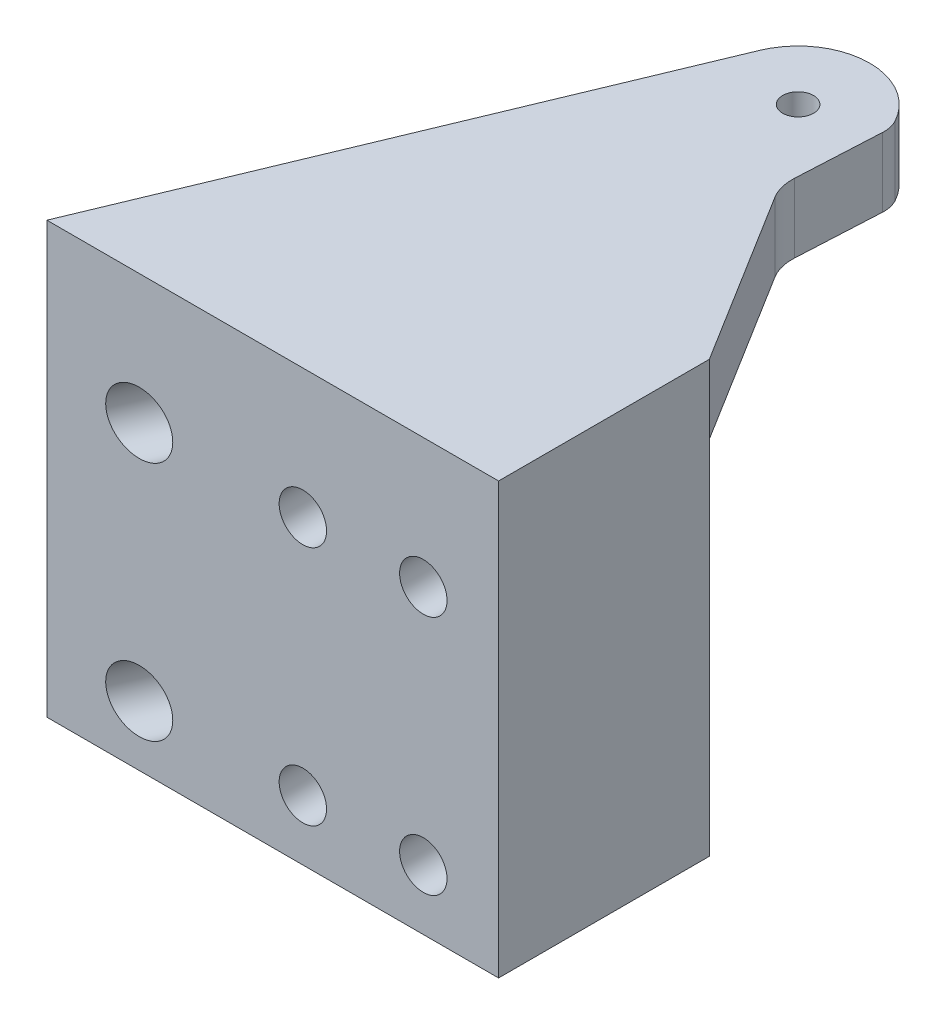
ISO-10303-21;
HEADER;
FILE_DESCRIPTION(('STEP AP214'),'2;1');
FILE_NAME('part.step','',(''),(''),'','','');
FILE_SCHEMA(('AUTOMOTIVE_DESIGN { 1 0 10303 214 1 1 1 1 }'));
ENDSEC;
DATA;
#1=APPLICATION_CONTEXT('core data for automotive mechanical design processes');
#2=APPLICATION_PROTOCOL_DEFINITION('international standard','automotive_design',2000,#1);
#3=PRODUCT_CONTEXT('',#1,'mechanical');
#4=PRODUCT('Part','Part','',(#3));
#5=PRODUCT_RELATED_PRODUCT_CATEGORY('part','',(#4));
#6=PRODUCT_DEFINITION_FORMATION('','',#4);
#7=PRODUCT_DEFINITION_CONTEXT('part definition',#1,'design');
#8=PRODUCT_DEFINITION('design','',#6,#7);
#9=PRODUCT_DEFINITION_SHAPE('','',#8);
#10=(LENGTH_UNIT() NAMED_UNIT(*) SI_UNIT(.MILLI.,.METRE.));
#11=(NAMED_UNIT(*) PLANE_ANGLE_UNIT() SI_UNIT($,.RADIAN.));
#12=(NAMED_UNIT(*) SI_UNIT($,.STERADIAN.) SOLID_ANGLE_UNIT());
#13=UNCERTAINTY_MEASURE_WITH_UNIT(LENGTH_MEASURE(1.E-05),#10,'distance_accuracy_value','');
#14=(GEOMETRIC_REPRESENTATION_CONTEXT(3) GLOBAL_UNCERTAINTY_ASSIGNED_CONTEXT((#13)) GLOBAL_UNIT_ASSIGNED_CONTEXT((#10,
#11,#12)) REPRESENTATION_CONTEXT('',''));
#15=CARTESIAN_POINT('',(0.,0.,0.));
#16=DIRECTION('',(0.,0.,1.));
#17=DIRECTION('',(1.,0.,0.));
#18=AXIS2_PLACEMENT_3D('',#15,#16,#17);
#19=CARTESIAN_POINT('',(13.39,48.,-19.59));
#20=DIRECTION('',(0.,1.,0.));
#21=DIRECTION('',(0.,0.,1.));
#22=AXIS2_PLACEMENT_3D('',#19,#20,#21);
#23=PLANE('',#22);
#24=CARTESIAN_POINT('',(13.39,48.,-19.59));
#25=DIRECTION('',(0.,1.,0.));
#26=DIRECTION('',(0.,0.,1.));
#27=AXIS2_PLACEMENT_3D('',#24,#25,#26);
#28=CIRCLE('',#27,2.05);
#29=CARTESIAN_POINT('',(13.39,48.,-17.54));
#30=VERTEX_POINT('',#29);
#31=EDGE_CURVE('E195',#30,#30,#28,.T.);
#32=ORIENTED_EDGE('',*,*,#31,.T.);
#33=EDGE_LOOP('',(#32));
#34=FACE_BOUND('',#33,.T.);
#35=DIRECTION('',(0.910085172918903,0.,0.414421256734219));
#36=VECTOR('',#35,1.);
#37=CARTESIAN_POINT('',(3.70179696506069,48.,1.68567008460874));
#38=LINE('',#37,#36);
#39=CARTESIAN_POINT('',(-4.23961622686856,48.,-1.93057434303044));
#40=VERTEX_POINT('',#39);
#41=CARTESIAN_POINT('',(0.,48.,0.));
#42=VERTEX_POINT('',#41);
#43=EDGE_CURVE('E142',#40,#42,#38,.T.);
#44=ORIENTED_EDGE('',*,*,#43,.F.);
#45=DIRECTION('',(-0.383871492776041,0.,0.923386526344138));
#46=VECTOR('',#45,1.);
#47=CARTESIAN_POINT('',(-4.29919251697204,48.,-1.78726611460927));
#48=LINE('',#47,#46);
#49=CARTESIAN_POINT('',(4.61782799973069,48.,-23.2367791813724));
#50=VERTEX_POINT('',#49);
#51=EDGE_CURVE('E273',#50,#40,#48,.T.);
#52=ORIENTED_EDGE('',*,*,#51,.F.);
#53=CARTESIAN_POINT('',(13.39,48.,-19.59));
#54=DIRECTION('',(0.,1.,0.));
#55=DIRECTION('',(0.,0.,1.));
#56=AXIS2_PLACEMENT_3D('',#53,#54,#55);
#57=CIRCLE('',#56,9.50000000000001);
#58=CARTESIAN_POINT('',(21.7590573215834,48.,-24.0854287390694));
#59=VERTEX_POINT('',#58);
#60=EDGE_CURVE('E254',#59,#50,#57,.T.);
#61=ORIENTED_EDGE('',*,*,#60,.F.);
#62=CARTESIAN_POINT('',(18.2352437124957,48.,-22.1926166384086));
#63=DIRECTION('',(0.,1.,0.));
#64=DIRECTION('',(0.,0.,1.));
#65=AXIS2_PLACEMENT_3D('',#62,#63,#64);
#66=CIRCLE('',#65,4.);
#67=CARTESIAN_POINT('',(22.2299105121146,48.,-21.9861289631768));
#68=VERTEX_POINT('',#67);
#69=EDGE_CURVE('E198',#59,#68,#66,.F.);
#70=ORIENTED_EDGE('',*,*,#69,.T.);
#71=DIRECTION('',(0.051621918807937,0.,-0.998666699904721));
#72=VECTOR('',#71,1.);
#73=CARTESIAN_POINT('',(21.0372188326345,48.,1.0874314750123));
#74=LINE('',#73,#72);
#75=CARTESIAN_POINT('',(21.6527019401257,48.,-10.8195742698201));
#76=VERTEX_POINT('',#75);
#77=EDGE_CURVE('E260',#76,#68,#74,.T.);
#78=ORIENTED_EDGE('',*,*,#77,.F.);
#79=CARTESIAN_POINT('',(27.644702139554,48.,-10.5098427569724));
#80=DIRECTION('',(0.,1.,0.));
#81=DIRECTION('',(0.,0.,1.));
#82=AXIS2_PLACEMENT_3D('',#79,#80,#81);
#83=CIRCLE('',#82,6.);
#84=CARTESIAN_POINT('',(22.5481581017996,48.,-7.34357699566459));
#85=VERTEX_POINT('',#84);
#86=EDGE_CURVE('E69',#76,#85,#83,.T.);
#87=ORIENTED_EDGE('',*,*,#86,.T.);
#88=DIRECTION('',(-0.527710960217974,0.,-0.849424006292396));
#89=VECTOR('',#88,1.);
#90=CARTESIAN_POINT('',(19.5607338113645,48.,-12.1522508731759));
#91=LINE('',#90,#89);
#92=CARTESIAN_POINT('',(36.8201941380977,48.,15.6292451395707));
#93=VERTEX_POINT('',#92);
#94=EDGE_CURVE('E166',#93,#85,#91,.T.);
#95=ORIENTED_EDGE('',*,*,#94,.F.);
#96=DIRECTION('',(-0.920504853452443,0.,-0.390731128489268));
#97=VECTOR('',#96,1.);
#98=CARTESIAN_POINT('',(36.8201941380977,48.,15.6292451395707));
#99=LINE('',#98,#97);
#100=EDGE_CURVE('E159',#93,#42,#99,.T.);
#101=ORIENTED_EDGE('',*,*,#100,.T.);
#102=EDGE_LOOP('',(#44,#52,#61,#70,#78,#87,#95,#101));
#103=FACE_BOUND('',#102,.T.);
#104=ADVANCED_FACE('F60',(#34,#103),#23,.F.);
#105=CARTESIAN_POINT('',(36.8201941380977,48.,15.6292451395707));
#106=DIRECTION('',(-0.390731128489268,0.,0.920504853452443));
#107=DIRECTION('',(0.920504853452443,0.,0.390731128489268));
#108=AXIS2_PLACEMENT_3D('',#105,#106,#107);
#109=PLANE('',#108);
#110=CARTESIAN_POINT('',(6.44353397416709,40.,2.73511789942487));
#111=DIRECTION('',(0.390731128489268,0.,-0.920504853452443));
#112=DIRECTION('',(-0.920504853452443,0.,-0.390731128489268));
#113=AXIS2_PLACEMENT_3D('',#110,#111,#112);
#114=CIRCLE('',#113,2.05);
#115=CARTESIAN_POINT('',(4.55649902458958,40.,1.93411908602187));
#116=VERTEX_POINT('',#115);
#117=EDGE_CURVE('E218',#116,#116,#114,.T.);
#118=ORIENTED_EDGE('',*,*,#117,.F.);
#119=EDGE_LOOP('',(#118));
#120=FACE_BOUND('',#119,.T.);
#121=CARTESIAN_POINT('',(6.44353397416709,8.,2.73511789942487));
#122=DIRECTION('',(0.390731128489268,0.,-0.920504853452443));
#123=DIRECTION('',(-0.920504853452443,0.,-0.390731128489268));
#124=AXIS2_PLACEMENT_3D('',#121,#122,#123);
#125=CIRCLE('',#124,2.05);
#126=CARTESIAN_POINT('',(4.55649902458958,8.,1.93411908602187));
#127=VERTEX_POINT('',#126);
#128=EDGE_CURVE('E224',#127,#127,#125,.T.);
#129=ORIENTED_EDGE('',*,*,#128,.F.);
#130=EDGE_LOOP('',(#129));
#131=FACE_BOUND('',#130,.T.);
#132=DIRECTION('',(-0.920504853452443,0.,-0.390731128489268));
#133=VECTOR('',#132,1.);
#134=CARTESIAN_POINT('',(36.8201941380977,0.,15.6292451395707));
#135=LINE('',#134,#133);
#136=CARTESIAN_POINT('',(36.8201941380977,0.,15.6292451395707));
#137=VERTEX_POINT('',#136);
#138=CARTESIAN_POINT('',(0.,0.,0.));
#139=VERTEX_POINT('',#138);
#140=EDGE_CURVE('E162',#137,#139,#135,.T.);
#141=ORIENTED_EDGE('',*,*,#140,.T.);
#142=DIRECTION('',(0.,-1.,0.));
#143=VECTOR('',#142,1.);
#144=CARTESIAN_POINT('',(0.,48.,0.));
#145=LINE('',#144,#143);
#146=EDGE_CURVE('E146',#42,#139,#145,.T.);
#147=ORIENTED_EDGE('',*,*,#146,.F.);
#148=ORIENTED_EDGE('',*,*,#100,.F.);
#149=DIRECTION('',(0.,-1.,0.));
#150=VECTOR('',#149,1.);
#151=CARTESIAN_POINT('',(36.8201941380977,48.,15.6292451395707));
#152=LINE('',#151,#150);
#153=EDGE_CURVE('E167',#93,#137,#152,.T.);
#154=ORIENTED_EDGE('',*,*,#153,.T.);
#155=EDGE_LOOP('',(#141,#147,#148,#154));
#156=FACE_BOUND('',#155,.T.);
#157=ADVANCED_FACE('F157',(#120,#131,#156),#109,.F.);
#158=CARTESIAN_POINT('',(0.,48.,43.6292451395707));
#159=DIRECTION('',(0.,0.,-1.));
#160=DIRECTION('',(-1.,0.,0.));
#161=AXIS2_PLACEMENT_3D('',#158,#159,#160);
#162=PLANE('',#161);
#163=CARTESIAN_POINT('',(-10.9149931701457,40.,43.6292451395707));
#164=DIRECTION('',(0.,0.,-1.));
#165=DIRECTION('',(1.,0.,0.));
#166=AXIS2_PLACEMENT_3D('',#163,#164,#165);
#167=ELLIPSE('',#166,4.4540775473617,4.1);
#168=CARTESIAN_POINT('',(-6.460915622784,40.,43.6292451395707));
#169=VERTEX_POINT('',#168);
#170=EDGE_CURVE('E153',#169,#169,#167,.T.);
#171=ORIENTED_EDGE('',*,*,#170,.T.);
#172=EDGE_LOOP('',(#171));
#173=FACE_BOUND('',#172,.T.);
#174=CARTESIAN_POINT('',(-10.9149931701457,8.,43.6292451395707));
#175=DIRECTION('',(0.,0.,-1.));
#176=DIRECTION('',(1.,0.,0.));
#177=AXIS2_PLACEMENT_3D('',#174,#175,#176);
#178=ELLIPSE('',#177,4.4540775473617,4.1);
#179=CARTESIAN_POINT('',(-6.460915622784,8.,43.6292451395707));
#180=VERTEX_POINT('',#179);
#181=EDGE_CURVE('E211',#180,#180,#178,.T.);
#182=ORIENTED_EDGE('',*,*,#181,.T.);
#183=EDGE_LOOP('',(#182));
#184=FACE_BOUND('',#183,.T.);
#185=DIRECTION('',(0.,-1.,0.));
#186=VECTOR('',#185,1.);
#187=CARTESIAN_POINT('',(-23.1798058619023,57.18,43.6292451395707));
#188=LINE('',#187,#186);
#189=CARTESIAN_POINT('',(-23.1798058619023,57.18,43.6292451395707));
#190=VERTEX_POINT('',#189);
#191=CARTESIAN_POINT('',(-23.1798058619023,0.,43.6292451395707));
#192=VERTEX_POINT('',#191);
#193=EDGE_CURVE('E278',#190,#192,#188,.T.);
#194=ORIENTED_EDGE('',*,*,#193,.T.);
#195=DIRECTION('',(1.,0.,0.));
#196=VECTOR('',#195,1.);
#197=CARTESIAN_POINT('',(0.,0.,43.6292451395707));
#198=LINE('',#197,#196);
#199=CARTESIAN_POINT('',(36.8201941380977,0.,43.6292451395707));
#200=VERTEX_POINT('',#199);
#201=EDGE_CURVE('E171',#192,#200,#198,.T.);
#202=ORIENTED_EDGE('',*,*,#201,.T.);
#203=DIRECTION('',(0.,-1.,0.));
#204=VECTOR('',#203,1.);
#205=CARTESIAN_POINT('',(36.8201941380977,48.,43.6292451395707));
#206=LINE('',#205,#204);
#207=CARTESIAN_POINT('',(36.8201941380977,57.18,43.6292451395707));
#208=VERTEX_POINT('',#207);
#209=EDGE_CURVE('E164',#208,#200,#206,.T.);
#210=ORIENTED_EDGE('',*,*,#209,.F.);
#211=DIRECTION('',(1.,0.,0.));
#212=VECTOR('',#211,1.);
#213=CARTESIAN_POINT('',(0.,57.18,43.6292451395707));
#214=LINE('',#213,#212);
#215=EDGE_CURVE('E262',#190,#208,#214,.T.);
#216=ORIENTED_EDGE('',*,*,#215,.F.);
#217=EDGE_LOOP('',(#194,#202,#210,#216));
#218=FACE_BOUND('',#217,.T.);
#219=CARTESIAN_POINT('',(10.8201941380977,8.,43.6292451395707));
#220=DIRECTION('',(0.,0.,1.));
#221=DIRECTION('',(1.,0.,0.));
#222=AXIS2_PLACEMENT_3D('',#219,#220,#221);
#223=CIRCLE('',#222,3.15);
#224=CARTESIAN_POINT('',(13.9701941380977,8.,43.6292451395707));
#225=VERTEX_POINT('',#224);
#226=EDGE_CURVE('E284',#225,#225,#223,.T.);
#227=ORIENTED_EDGE('',*,*,#226,.F.);
#228=EDGE_LOOP('',(#227));
#229=FACE_BOUND('',#228,.T.);
#230=CARTESIAN_POINT('',(26.8201941380977,8.,43.6292451395707));
#231=DIRECTION('',(0.,0.,1.));
#232=DIRECTION('',(1.,0.,0.));
#233=AXIS2_PLACEMENT_3D('',#230,#231,#232);
#234=CIRCLE('',#233,3.14999999999998);
#235=CARTESIAN_POINT('',(29.9701941380977,8.,43.6292451395707));
#236=VERTEX_POINT('',#235);
#237=EDGE_CURVE('E294',#236,#236,#234,.T.);
#238=ORIENTED_EDGE('',*,*,#237,.F.);
#239=EDGE_LOOP('',(#238));
#240=FACE_BOUND('',#239,.T.);
#241=CARTESIAN_POINT('',(26.8201941380977,40.,43.6292451395707));
#242=DIRECTION('',(0.,0.,1.));
#243=DIRECTION('',(1.,0.,0.));
#244=AXIS2_PLACEMENT_3D('',#241,#242,#243);
#245=CIRCLE('',#244,3.14999999999998);
#246=CARTESIAN_POINT('',(29.9701941380977,40.,43.6292451395707));
#247=VERTEX_POINT('',#246);
#248=EDGE_CURVE('E288',#247,#247,#245,.T.);
#249=ORIENTED_EDGE('',*,*,#248,.F.);
#250=EDGE_LOOP('',(#249));
#251=FACE_BOUND('',#250,.T.);
#252=CARTESIAN_POINT('',(10.8201941380977,40.,43.6292451395707));
#253=DIRECTION('',(0.,0.,1.));
#254=DIRECTION('',(1.,0.,0.));
#255=AXIS2_PLACEMENT_3D('',#252,#253,#254);
#256=CIRCLE('',#255,3.15);
#257=CARTESIAN_POINT('',(13.9701941380977,40.,43.6292451395707));
#258=VERTEX_POINT('',#257);
#259=EDGE_CURVE('E175',#258,#258,#256,.T.);
#260=ORIENTED_EDGE('',*,*,#259,.F.);
#261=EDGE_LOOP('',(#260));
#262=FACE_BOUND('',#261,.T.);
#263=ADVANCED_FACE('F309',(#173,#184,#218,#229,#240,#251,#262),#162,.F.);
#264=CARTESIAN_POINT('',(36.8201941380977,48.,15.6292451395707));
#265=DIRECTION('',(-1.,0.,0.));
#266=DIRECTION('',(0.,0.,1.));
#267=AXIS2_PLACEMENT_3D('',#264,#265,#266);
#268=PLANE('',#267);
#269=DIRECTION('',(0.,0.,-1.));
#270=VECTOR('',#269,1.);
#271=CARTESIAN_POINT('',(36.8201941380977,0.,15.6292451395707));
#272=LINE('',#271,#270);
#273=EDGE_CURVE('E168',#200,#137,#272,.T.);
#274=ORIENTED_EDGE('',*,*,#273,.T.);
#275=ORIENTED_EDGE('',*,*,#153,.F.);
#276=DIRECTION('',(0.,-1.,0.));
#277=VECTOR('',#276,1.);
#278=CARTESIAN_POINT('',(36.8201941380977,57.18,15.6292451395707));
#279=LINE('',#278,#277);
#280=CARTESIAN_POINT('',(36.8201941380977,57.18,15.6292451395707));
#281=VERTEX_POINT('',#280);
#282=EDGE_CURVE('E271',#281,#93,#279,.T.);
#283=ORIENTED_EDGE('',*,*,#282,.F.);
#284=DIRECTION('',(0.,0.,-1.));
#285=VECTOR('',#284,1.);
#286=CARTESIAN_POINT('',(36.8201941380977,57.18,0.));
#287=LINE('',#286,#285);
#288=EDGE_CURVE('E265',#208,#281,#287,.T.);
#289=ORIENTED_EDGE('',*,*,#288,.F.);
#290=ORIENTED_EDGE('',*,*,#209,.T.);
#291=EDGE_LOOP('',(#274,#275,#283,#289,#290));
#292=FACE_BOUND('',#291,.T.);
#293=ADVANCED_FACE('F311',(#292),#268,.F.);
#294=CARTESIAN_POINT('',(0.,0.,0.));
#295=DIRECTION('',(0.,1.,0.));
#296=DIRECTION('',(0.,0.,1.));
#297=AXIS2_PLACEMENT_3D('',#294,#295,#296);
#298=PLANE('',#297);
#299=ORIENTED_EDGE('',*,*,#140,.F.);
#300=ORIENTED_EDGE('',*,*,#273,.F.);
#301=ORIENTED_EDGE('',*,*,#201,.F.);
#302=DIRECTION('',(0.383871492776041,0.,-0.923386526344138));
#303=VECTOR('',#302,1.);
#304=CARTESIAN_POINT('',(4.61782799973069,0.,-23.2367791813724));
#305=LINE('',#304,#303);
#306=CARTESIAN_POINT('',(-4.23961622686856,0.,-1.93057434303045));
#307=VERTEX_POINT('',#306);
#308=EDGE_CURVE('E236',#192,#307,#305,.T.);
#309=ORIENTED_EDGE('',*,*,#308,.T.);
#310=DIRECTION('',(-0.910085172918903,0.,-0.414421256734219));
#311=VECTOR('',#310,1.);
#312=CARTESIAN_POINT('',(3.70179696506069,0.,1.68567008460874));
#313=LINE('',#312,#311);
#314=EDGE_CURVE('E235',#139,#307,#313,.T.);
#315=ORIENTED_EDGE('',*,*,#314,.F.);
#316=EDGE_LOOP('',(#299,#300,#301,#309,#315));
#317=FACE_BOUND('',#316,.T.);
#318=ADVANCED_FACE('F318',(#317),#298,.F.);
#319=CARTESIAN_POINT('',(10.8201941380977,40.,38.9292451395707));
#320=DIRECTION('',(0.,0.,1.));
#321=DIRECTION('',(1.,0.,0.));
#322=AXIS2_PLACEMENT_3D('',#319,#320,#321);
#323=CYLINDRICAL_SURFACE('',#322,3.15);
#324=CARTESIAN_POINT('',(10.8201941380977,40.,38.9292451395707));
#325=DIRECTION('',(0.,0.,1.));
#326=DIRECTION('',(1.,0.,0.));
#327=AXIS2_PLACEMENT_3D('',#324,#325,#326);
#328=CIRCLE('',#327,3.15);
#329=CARTESIAN_POINT('',(13.9701941380977,40.,38.9292451395707));
#330=VERTEX_POINT('',#329);
#331=EDGE_CURVE('E178',#330,#330,#328,.T.);
#332=ORIENTED_EDGE('',*,*,#331,.F.);
#333=EDGE_LOOP('',(#332));
#334=FACE_BOUND('',#333,.T.);
#335=ORIENTED_EDGE('',*,*,#259,.T.);
#336=EDGE_LOOP('',(#335));
#337=FACE_BOUND('',#336,.T.);
#338=ADVANCED_FACE('F307',(#334,#337),#323,.F.);
#339=CARTESIAN_POINT('',(0.,0.,38.9292451395707));
#340=DIRECTION('',(0.,0.,1.));
#341=DIRECTION('',(1.,0.,0.));
#342=AXIS2_PLACEMENT_3D('',#339,#340,#341);
#343=PLANE('',#342);
#344=CARTESIAN_POINT('',(10.8201941380977,40.,38.9292451395707));
#345=DIRECTION('',(0.,0.,1.));
#346=DIRECTION('',(1.,0.,0.));
#347=AXIS2_PLACEMENT_3D('',#344,#345,#346);
#348=CIRCLE('',#347,2.);
#349=CARTESIAN_POINT('',(12.8201941380977,40.,38.9292451395707));
#350=VERTEX_POINT('',#349);
#351=EDGE_CURVE('E192',#350,#350,#348,.T.);
#352=ORIENTED_EDGE('',*,*,#351,.F.);
#353=EDGE_LOOP('',(#352));
#354=FACE_BOUND('',#353,.T.);
#355=ORIENTED_EDGE('',*,*,#331,.T.);
#356=EDGE_LOOP('',(#355));
#357=FACE_BOUND('',#356,.T.);
#358=ADVANCED_FACE('F357',(#354,#357),#343,.T.);
#359=CARTESIAN_POINT('',(26.8201941380977,40.,38.9292451395707));
#360=DIRECTION('',(0.,0.,1.));
#361=DIRECTION('',(1.,0.,0.));
#362=AXIS2_PLACEMENT_3D('',#359,#360,#361);
#363=CYLINDRICAL_SURFACE('',#362,3.14999999999998);
#364=CARTESIAN_POINT('',(26.8201941380977,40.,38.9292451395707));
#365=DIRECTION('',(0.,0.,1.));
#366=DIRECTION('',(1.,0.,0.));
#367=AXIS2_PLACEMENT_3D('',#364,#365,#366);
#368=CIRCLE('',#367,3.14999999999998);
#369=CARTESIAN_POINT('',(29.9701941380977,40.,38.9292451395707));
#370=VERTEX_POINT('',#369);
#371=EDGE_CURVE('E285',#370,#370,#368,.T.);
#372=ORIENTED_EDGE('',*,*,#371,.F.);
#373=EDGE_LOOP('',(#372));
#374=FACE_BOUND('',#373,.T.);
#375=ORIENTED_EDGE('',*,*,#248,.T.);
#376=EDGE_LOOP('',(#375));
#377=FACE_BOUND('',#376,.T.);
#378=ADVANCED_FACE('F353',(#374,#377),#363,.F.);
#379=CARTESIAN_POINT('',(0.,0.,38.9292451395707));
#380=DIRECTION('',(0.,0.,1.));
#381=DIRECTION('',(1.,0.,0.));
#382=AXIS2_PLACEMENT_3D('',#379,#380,#381);
#383=PLANE('',#382);
#384=CARTESIAN_POINT('',(26.8201941380977,40.,38.9292451395707));
#385=DIRECTION('',(0.,0.,1.));
#386=DIRECTION('',(1.,0.,0.));
#387=AXIS2_PLACEMENT_3D('',#384,#385,#386);
#388=CIRCLE('',#387,2.);
#389=CARTESIAN_POINT('',(28.8201941380977,40.,38.9292451395707));
#390=VERTEX_POINT('',#389);
#391=EDGE_CURVE('E189',#390,#390,#388,.T.);
#392=ORIENTED_EDGE('',*,*,#391,.F.);
#393=EDGE_LOOP('',(#392));
#394=FACE_BOUND('',#393,.T.);
#395=ORIENTED_EDGE('',*,*,#371,.T.);
#396=EDGE_LOOP('',(#395));
#397=FACE_BOUND('',#396,.T.);
#398=ADVANCED_FACE('F349',(#394,#397),#383,.T.);
#399=CARTESIAN_POINT('',(26.8201941380977,8.,38.9292451395707));
#400=DIRECTION('',(0.,0.,1.));
#401=DIRECTION('',(1.,0.,0.));
#402=AXIS2_PLACEMENT_3D('',#399,#400,#401);
#403=CYLINDRICAL_SURFACE('',#402,3.14999999999998);
#404=CARTESIAN_POINT('',(26.8201941380977,8.,38.9292451395707));
#405=DIRECTION('',(0.,0.,1.));
#406=DIRECTION('',(1.,0.,0.));
#407=AXIS2_PLACEMENT_3D('',#404,#405,#406);
#408=CIRCLE('',#407,3.14999999999998);
#409=CARTESIAN_POINT('',(29.9701941380977,8.,38.9292451395707));
#410=VERTEX_POINT('',#409);
#411=EDGE_CURVE('E291',#410,#410,#408,.T.);
#412=ORIENTED_EDGE('',*,*,#411,.F.);
#413=EDGE_LOOP('',(#412));
#414=FACE_BOUND('',#413,.T.);
#415=ORIENTED_EDGE('',*,*,#237,.T.);
#416=EDGE_LOOP('',(#415));
#417=FACE_BOUND('',#416,.T.);
#418=ADVANCED_FACE('F352',(#414,#417),#403,.F.);
#419=CARTESIAN_POINT('',(0.,0.,38.9292451395707));
#420=DIRECTION('',(0.,0.,1.));
#421=DIRECTION('',(1.,0.,0.));
#422=AXIS2_PLACEMENT_3D('',#419,#420,#421);
#423=PLANE('',#422);
#424=CARTESIAN_POINT('',(26.8201941380977,8.,38.9292451395707));
#425=DIRECTION('',(0.,0.,1.));
#426=DIRECTION('',(1.,0.,0.));
#427=AXIS2_PLACEMENT_3D('',#424,#425,#426);
#428=CIRCLE('',#427,2.);
#429=CARTESIAN_POINT('',(28.8201941380977,8.,38.9292451395707));
#430=VERTEX_POINT('',#429);
#431=EDGE_CURVE('E185',#430,#430,#428,.T.);
#432=ORIENTED_EDGE('',*,*,#431,.F.);
#433=EDGE_LOOP('',(#432));
#434=FACE_BOUND('',#433,.T.);
#435=ORIENTED_EDGE('',*,*,#411,.T.);
#436=EDGE_LOOP('',(#435));
#437=FACE_BOUND('',#436,.T.);
#438=ADVANCED_FACE('F359',(#434,#437),#423,.T.);
#439=CARTESIAN_POINT('',(10.8201941380977,8.,38.9292451395707));
#440=DIRECTION('',(0.,0.,1.));
#441=DIRECTION('',(1.,0.,0.));
#442=AXIS2_PLACEMENT_3D('',#439,#440,#441);
#443=CYLINDRICAL_SURFACE('',#442,3.15);
#444=CARTESIAN_POINT('',(10.8201941380977,8.,38.9292451395707));
#445=DIRECTION('',(0.,0.,1.));
#446=DIRECTION('',(1.,0.,0.));
#447=AXIS2_PLACEMENT_3D('',#444,#445,#446);
#448=CIRCLE('',#447,3.15);
#449=CARTESIAN_POINT('',(13.9701941380977,8.,38.9292451395707));
#450=VERTEX_POINT('',#449);
#451=EDGE_CURVE('E297',#450,#450,#448,.T.);
#452=ORIENTED_EDGE('',*,*,#451,.F.);
#453=EDGE_LOOP('',(#452));
#454=FACE_BOUND('',#453,.T.);
#455=ORIENTED_EDGE('',*,*,#226,.T.);
#456=EDGE_LOOP('',(#455));
#457=FACE_BOUND('',#456,.T.);
#458=ADVANCED_FACE('F362',(#454,#457),#443,.F.);
#459=CARTESIAN_POINT('',(0.,0.,38.9292451395707));
#460=DIRECTION('',(0.,0.,1.));
#461=DIRECTION('',(1.,0.,0.));
#462=AXIS2_PLACEMENT_3D('',#459,#460,#461);
#463=PLANE('',#462);
#464=CARTESIAN_POINT('',(10.8201941380977,8.,38.9292451395707));
#465=DIRECTION('',(0.,0.,1.));
#466=DIRECTION('',(1.,0.,0.));
#467=AXIS2_PLACEMENT_3D('',#464,#465,#466);
#468=CIRCLE('',#467,2.);
#469=CARTESIAN_POINT('',(12.8201941380977,8.,38.9292451395707));
#470=VERTEX_POINT('',#469);
#471=EDGE_CURVE('E182',#470,#470,#468,.T.);
#472=ORIENTED_EDGE('',*,*,#471,.F.);
#473=EDGE_LOOP('',(#472));
#474=FACE_BOUND('',#473,.T.);
#475=ORIENTED_EDGE('',*,*,#451,.T.);
#476=EDGE_LOOP('',(#475));
#477=FACE_BOUND('',#476,.T.);
#478=ADVANCED_FACE('F367',(#474,#477),#463,.T.);
#479=CARTESIAN_POINT('',(13.39,57.18,-19.59));
#480=DIRECTION('',(0.,1.,0.));
#481=DIRECTION('',(0.,0.,1.));
#482=AXIS2_PLACEMENT_3D('',#479,#480,#481);
#483=PLANE('',#482);
#484=DIRECTION('',(-0.527710960217974,0.,-0.849424006292396));
#485=VECTOR('',#484,1.);
#486=CARTESIAN_POINT('',(19.5607338113645,57.18,-12.1522508731759));
#487=LINE('',#486,#485);
#488=CARTESIAN_POINT('',(22.5481581017996,57.18,-7.34357699566459));
#489=VERTEX_POINT('',#488);
#490=EDGE_CURVE('E267',#281,#489,#487,.T.);
#491=ORIENTED_EDGE('',*,*,#490,.T.);
#492=CARTESIAN_POINT('',(27.644702139554,57.18,-10.5098427569724));
#493=DIRECTION('',(0.,1.,0.));
#494=DIRECTION('',(0.,0.,1.));
#495=AXIS2_PLACEMENT_3D('',#492,#493,#494);
#496=CIRCLE('',#495,6.);
#497=CARTESIAN_POINT('',(21.6527019401257,57.18,-10.8195742698201));
#498=VERTEX_POINT('',#497);
#499=EDGE_CURVE('E12',#489,#498,#496,.F.);
#500=ORIENTED_EDGE('',*,*,#499,.T.);
#501=DIRECTION('',(0.051621918807937,0.,-0.998666699904721));
#502=VECTOR('',#501,1.);
#503=CARTESIAN_POINT('',(21.0372188326345,57.18,1.0874314750123));
#504=LINE('',#503,#502);
#505=CARTESIAN_POINT('',(22.2299105121146,57.18,-21.9861289631768));
#506=VERTEX_POINT('',#505);
#507=EDGE_CURVE('E269',#498,#506,#504,.T.);
#508=ORIENTED_EDGE('',*,*,#507,.T.);
#509=CARTESIAN_POINT('',(18.2352437124957,57.18,-22.1926166384086));
#510=DIRECTION('',(0.,1.,0.));
#511=DIRECTION('',(0.,0.,1.));
#512=AXIS2_PLACEMENT_3D('',#509,#510,#511);
#513=CIRCLE('',#512,4.);
#514=CARTESIAN_POINT('',(21.7590573215834,57.18,-24.0854287390694));
#515=VERTEX_POINT('',#514);
#516=EDGE_CURVE('E204',#506,#515,#513,.T.);
#517=ORIENTED_EDGE('',*,*,#516,.T.);
#518=CARTESIAN_POINT('',(13.39,57.18,-19.59));
#519=DIRECTION('',(0.,1.,0.));
#520=DIRECTION('',(0.,0.,1.));
#521=AXIS2_PLACEMENT_3D('',#518,#519,#520);
#522=CIRCLE('',#521,9.50000000000001);
#523=CARTESIAN_POINT('',(4.61782799973069,57.18,-23.2367791813724));
#524=VERTEX_POINT('',#523);
#525=EDGE_CURVE('E257',#515,#524,#522,.T.);
#526=ORIENTED_EDGE('',*,*,#525,.T.);
#527=DIRECTION('',(-0.383871492776041,0.,0.923386526344138));
#528=VECTOR('',#527,1.);
#529=CARTESIAN_POINT('',(-4.29919251697204,57.18,-1.78726611460927));
#530=LINE('',#529,#528);
#531=EDGE_CURVE('E259',#524,#190,#530,.T.);
#532=ORIENTED_EDGE('',*,*,#531,.T.);
#533=ORIENTED_EDGE('',*,*,#215,.T.);
#534=ORIENTED_EDGE('',*,*,#288,.T.);
#535=EDGE_LOOP('',(#491,#500,#508,#517,#526,#532,#533,#534));
#536=FACE_BOUND('',#535,.T.);
#537=CARTESIAN_POINT('',(13.39,57.18,-19.59));
#538=DIRECTION('',(0.,1.,0.));
#539=DIRECTION('',(0.,0.,1.));
#540=AXIS2_PLACEMENT_3D('',#537,#538,#539);
#541=CIRCLE('',#540,2.05);
#542=CARTESIAN_POINT('',(13.39,57.18,-17.54));
#543=VERTEX_POINT('',#542);
#544=EDGE_CURVE('E251',#543,#543,#541,.T.);
#545=ORIENTED_EDGE('',*,*,#544,.F.);
#546=EDGE_LOOP('',(#545));
#547=FACE_BOUND('',#546,.T.);
#548=ADVANCED_FACE('F331',(#536,#547),#483,.T.);
#549=CARTESIAN_POINT('',(13.39,57.18,-19.59));
#550=DIRECTION('',(0.,-1.,0.));
#551=DIRECTION('',(0.,0.,-1.));
#552=AXIS2_PLACEMENT_3D('',#549,#550,#551);
#553=CYLINDRICAL_SURFACE('',#552,9.50000000000001);
#554=ORIENTED_EDGE('',*,*,#525,.F.);
#555=DIRECTION('',(0.,-1.,0.));
#556=VECTOR('',#555,1.);
#557=CARTESIAN_POINT('',(21.7590573215834,57.18,-24.0854287390694));
#558=LINE('',#557,#556);
#559=EDGE_CURVE('E163',#515,#59,#558,.T.);
#560=ORIENTED_EDGE('',*,*,#559,.T.);
#561=ORIENTED_EDGE('',*,*,#60,.T.);
#562=DIRECTION('',(0.,-1.,0.));
#563=VECTOR('',#562,1.);
#564=CARTESIAN_POINT('',(4.61782799973069,57.18,-23.2367791813724));
#565=LINE('',#564,#563);
#566=EDGE_CURVE('E281',#524,#50,#565,.T.);
#567=ORIENTED_EDGE('',*,*,#566,.F.);
#568=EDGE_LOOP('',(#554,#560,#561,#567));
#569=FACE_BOUND('',#568,.T.);
#570=ADVANCED_FACE('F344',(#569),#553,.T.);
#571=CARTESIAN_POINT('',(-4.29919251697204,57.18,-1.78726611460927));
#572=DIRECTION('',(0.923386526344138,0.,0.383871492776041));
#573=DIRECTION('',(0.383871492776041,0.,-0.923386526344138));
#574=AXIS2_PLACEMENT_3D('',#571,#572,#573);
#575=PLANE('',#574);
#576=ORIENTED_EDGE('',*,*,#51,.T.);
#577=DIRECTION('',(0.,1.,0.));
#578=VECTOR('',#577,1.);
#579=CARTESIAN_POINT('',(-4.23961622686856,-51.1175170668792,-1.93057434303044));
#580=LINE('',#579,#578);
#581=EDGE_CURVE('E149',#307,#40,#580,.T.);
#582=ORIENTED_EDGE('',*,*,#581,.F.);
#583=ORIENTED_EDGE('',*,*,#308,.F.);
#584=ORIENTED_EDGE('',*,*,#193,.F.);
#585=ORIENTED_EDGE('',*,*,#531,.F.);
#586=ORIENTED_EDGE('',*,*,#566,.T.);
#587=EDGE_LOOP('',(#576,#582,#583,#584,#585,#586));
#588=FACE_BOUND('',#587,.T.);
#589=ADVANCED_FACE('F341',(#588),#575,.F.);
#590=CARTESIAN_POINT('',(19.5607338113645,57.18,-12.1522508731759));
#591=DIRECTION('',(-0.849424006292395,0.,0.527710960217974));
#592=DIRECTION('',(0.527710960217974,0.,0.849424006292396));
#593=AXIS2_PLACEMENT_3D('',#590,#591,#592);
#594=PLANE('',#593);
#595=ORIENTED_EDGE('',*,*,#94,.T.);
#596=DIRECTION('',(0.,-1.,0.));
#597=VECTOR('',#596,1.);
#598=CARTESIAN_POINT('',(22.5481581017996,57.18,-7.3435769956646));
#599=LINE('',#598,#597);
#600=EDGE_CURVE('E77',#85,#489,#599,.F.);
#601=ORIENTED_EDGE('',*,*,#600,.T.);
#602=ORIENTED_EDGE('',*,*,#490,.F.);
#603=ORIENTED_EDGE('',*,*,#282,.T.);
#604=EDGE_LOOP('',(#595,#601,#602,#603));
#605=FACE_BOUND('',#604,.T.);
#606=ADVANCED_FACE('F337',(#605),#594,.F.);
#607=CARTESIAN_POINT('',(21.0372188326345,57.18,1.0874314750123));
#608=DIRECTION('',(-0.998666699904721,0.,-0.051621918807937));
#609=DIRECTION('',(-0.051621918807937,0.,0.998666699904721));
#610=AXIS2_PLACEMENT_3D('',#607,#608,#609);
#611=PLANE('',#610);
#612=ORIENTED_EDGE('',*,*,#507,.F.);
#613=DIRECTION('',(0.,-1.,0.));
#614=VECTOR('',#613,1.);
#615=CARTESIAN_POINT('',(21.6527019401257,48.,-10.8195742698201));
#616=LINE('',#615,#614);
#617=EDGE_CURVE('E206',#498,#76,#616,.T.);
#618=ORIENTED_EDGE('',*,*,#617,.T.);
#619=ORIENTED_EDGE('',*,*,#77,.T.);
#620=DIRECTION('',(0.,-1.,0.));
#621=VECTOR('',#620,1.);
#622=CARTESIAN_POINT('',(22.2299105121146,57.18,-21.9861289631768));
#623=LINE('',#622,#621);
#624=EDGE_CURVE('E201',#68,#506,#623,.F.);
#625=ORIENTED_EDGE('',*,*,#624,.T.);
#626=EDGE_LOOP('',(#612,#618,#619,#625));
#627=FACE_BOUND('',#626,.T.);
#628=ADVANCED_FACE('F333',(#627),#611,.F.);
#629=CARTESIAN_POINT('',(13.39,57.18,-19.59));
#630=DIRECTION('',(0.,-1.,0.));
#631=DIRECTION('',(0.,0.,-1.));
#632=AXIS2_PLACEMENT_3D('',#629,#630,#631);
#633=CYLINDRICAL_SURFACE('',#632,2.05);
#634=ORIENTED_EDGE('',*,*,#544,.T.);
#635=EDGE_LOOP('',(#634));
#636=FACE_BOUND('',#635,.T.);
#637=ORIENTED_EDGE('',*,*,#31,.F.);
#638=EDGE_LOOP('',(#637));
#639=FACE_BOUND('',#638,.T.);
#640=ADVANCED_FACE('F336',(#636,#639),#633,.F.);
#641=CARTESIAN_POINT('',(10.8201941380977,8.,35.6292451395707));
#642=DIRECTION('',(0.,0.,1.));
#643=DIRECTION('',(1.,0.,0.));
#644=AXIS2_PLACEMENT_3D('',#641,#642,#643);
#645=CYLINDRICAL_SURFACE('',#644,2.);
#646=ORIENTED_EDGE('',*,*,#471,.T.);
#647=EDGE_LOOP('',(#646));
#648=FACE_BOUND('',#647,.T.);
#649=CARTESIAN_POINT('',(10.8201941380977,8.,35.6292451395707));
#650=DIRECTION('',(0.,0.,1.));
#651=DIRECTION('',(1.,0.,0.));
#652=AXIS2_PLACEMENT_3D('',#649,#650,#651);
#653=CIRCLE('',#652,2.);
#654=CARTESIAN_POINT('',(12.8201941380977,8.,35.6292451395707));
#655=VERTEX_POINT('',#654);
#656=EDGE_CURVE('E240',#655,#655,#653,.T.);
#657=ORIENTED_EDGE('',*,*,#656,.F.);
#658=EDGE_LOOP('',(#657));
#659=FACE_BOUND('',#658,.T.);
#660=ADVANCED_FACE('F420',(#648,#659),#645,.F.);
#661=CARTESIAN_POINT('',(0.,0.,35.6292451395707));
#662=DIRECTION('',(0.,0.,1.));
#663=DIRECTION('',(1.,0.,0.));
#664=AXIS2_PLACEMENT_3D('',#661,#662,#663);
#665=PLANE('',#664);
#666=ORIENTED_EDGE('',*,*,#656,.T.);
#667=EDGE_LOOP('',(#666));
#668=FACE_BOUND('',#667,.T.);
#669=ADVANCED_FACE('F425',(#668),#665,.T.);
#670=CARTESIAN_POINT('',(26.8201941380977,8.,35.6292451395707));
#671=DIRECTION('',(0.,0.,1.));
#672=DIRECTION('',(1.,0.,0.));
#673=AXIS2_PLACEMENT_3D('',#670,#671,#672);
#674=CYLINDRICAL_SURFACE('',#673,2.);
#675=ORIENTED_EDGE('',*,*,#431,.T.);
#676=EDGE_LOOP('',(#675));
#677=FACE_BOUND('',#676,.T.);
#678=CARTESIAN_POINT('',(26.8201941380977,8.,35.6292451395707));
#679=DIRECTION('',(0.,0.,1.));
#680=DIRECTION('',(1.,0.,0.));
#681=AXIS2_PLACEMENT_3D('',#678,#679,#680);
#682=CIRCLE('',#681,2.);
#683=CARTESIAN_POINT('',(28.8201941380977,8.,35.6292451395707));
#684=VERTEX_POINT('',#683);
#685=EDGE_CURVE('E244',#684,#684,#682,.T.);
#686=ORIENTED_EDGE('',*,*,#685,.F.);
#687=EDGE_LOOP('',(#686));
#688=FACE_BOUND('',#687,.T.);
#689=ADVANCED_FACE('F440',(#677,#688),#674,.F.);
#690=CARTESIAN_POINT('',(0.,0.,35.6292451395707));
#691=DIRECTION('',(0.,0.,1.));
#692=DIRECTION('',(1.,0.,0.));
#693=AXIS2_PLACEMENT_3D('',#690,#691,#692);
#694=PLANE('',#693);
#695=ORIENTED_EDGE('',*,*,#685,.T.);
#696=EDGE_LOOP('',(#695));
#697=FACE_BOUND('',#696,.T.);
#698=ADVANCED_FACE('F444',(#697),#694,.T.);
#699=CARTESIAN_POINT('',(26.8201941380977,40.,35.6292451395707));
#700=DIRECTION('',(0.,0.,1.));
#701=DIRECTION('',(1.,0.,0.));
#702=AXIS2_PLACEMENT_3D('',#699,#700,#701);
#703=CYLINDRICAL_SURFACE('',#702,2.);
#704=ORIENTED_EDGE('',*,*,#391,.T.);
#705=EDGE_LOOP('',(#704));
#706=FACE_BOUND('',#705,.T.);
#707=CARTESIAN_POINT('',(26.8201941380977,40.,35.6292451395707));
#708=DIRECTION('',(0.,0.,1.));
#709=DIRECTION('',(1.,0.,0.));
#710=AXIS2_PLACEMENT_3D('',#707,#708,#709);
#711=CIRCLE('',#710,2.);
#712=CARTESIAN_POINT('',(28.8201941380977,40.,35.6292451395707));
#713=VERTEX_POINT('',#712);
#714=EDGE_CURVE('E241',#713,#713,#711,.T.);
#715=ORIENTED_EDGE('',*,*,#714,.F.);
#716=EDGE_LOOP('',(#715));
#717=FACE_BOUND('',#716,.T.);
#718=ADVANCED_FACE('F448',(#706,#717),#703,.F.);
#719=CARTESIAN_POINT('',(0.,0.,35.6292451395707));
#720=DIRECTION('',(0.,0.,1.));
#721=DIRECTION('',(1.,0.,0.));
#722=AXIS2_PLACEMENT_3D('',#719,#720,#721);
#723=PLANE('',#722);
#724=ORIENTED_EDGE('',*,*,#714,.T.);
#725=EDGE_LOOP('',(#724));
#726=FACE_BOUND('',#725,.T.);
#727=ADVANCED_FACE('F433',(#726),#723,.T.);
#728=CARTESIAN_POINT('',(10.8201941380977,40.,35.6292451395707));
#729=DIRECTION('',(0.,0.,1.));
#730=DIRECTION('',(1.,0.,0.));
#731=AXIS2_PLACEMENT_3D('',#728,#729,#730);
#732=CYLINDRICAL_SURFACE('',#731,2.);
#733=ORIENTED_EDGE('',*,*,#351,.T.);
#734=EDGE_LOOP('',(#733));
#735=FACE_BOUND('',#734,.T.);
#736=CARTESIAN_POINT('',(10.8201941380977,40.,35.6292451395707));
#737=DIRECTION('',(0.,0.,1.));
#738=DIRECTION('',(1.,0.,0.));
#739=AXIS2_PLACEMENT_3D('',#736,#737,#738);
#740=CIRCLE('',#739,2.);
#741=CARTESIAN_POINT('',(12.8201941380977,40.,35.6292451395707));
#742=VERTEX_POINT('',#741);
#743=EDGE_CURVE('E186',#742,#742,#740,.T.);
#744=ORIENTED_EDGE('',*,*,#743,.F.);
#745=EDGE_LOOP('',(#744));
#746=FACE_BOUND('',#745,.T.);
#747=ADVANCED_FACE('F429',(#735,#746),#732,.F.);
#748=CARTESIAN_POINT('',(0.,0.,35.6292451395707));
#749=DIRECTION('',(0.,0.,1.));
#750=DIRECTION('',(1.,0.,0.));
#751=AXIS2_PLACEMENT_3D('',#748,#749,#750);
#752=PLANE('',#751);
#753=ORIENTED_EDGE('',*,*,#743,.T.);
#754=EDGE_LOOP('',(#753));
#755=FACE_BOUND('',#754,.T.);
#756=ADVANCED_FACE('F432',(#755),#752,.T.);
#757=CARTESIAN_POINT('',(18.2352437124957,57.18,-22.1926166384086));
#758=DIRECTION('',(0.,-1.,0.));
#759=DIRECTION('',(0.,0.,-1.));
#760=AXIS2_PLACEMENT_3D('',#757,#758,#759);
#761=CYLINDRICAL_SURFACE('',#760,4.);
#762=ORIENTED_EDGE('',*,*,#516,.F.);
#763=ORIENTED_EDGE('',*,*,#624,.F.);
#764=ORIENTED_EDGE('',*,*,#69,.F.);
#765=ORIENTED_EDGE('',*,*,#559,.F.);
#766=EDGE_LOOP('',(#762,#763,#764,#765));
#767=FACE_BOUND('',#766,.T.);
#768=ADVANCED_FACE('F395',(#767),#761,.T.);
#769=CARTESIAN_POINT('',(27.644702139554,57.18,-10.5098427569724));
#770=DIRECTION('',(0.,1.,0.));
#771=DIRECTION('',(0.,0.,1.));
#772=AXIS2_PLACEMENT_3D('',#769,#770,#771);
#773=CYLINDRICAL_SURFACE('',#772,6.);
#774=ORIENTED_EDGE('',*,*,#499,.F.);
#775=ORIENTED_EDGE('',*,*,#600,.F.);
#776=ORIENTED_EDGE('',*,*,#86,.F.);
#777=ORIENTED_EDGE('',*,*,#617,.F.);
#778=EDGE_LOOP('',(#774,#775,#776,#777));
#779=FACE_BOUND('',#778,.T.);
#780=ADVANCED_FACE('F62',(#779),#773,.F.);
#781=CARTESIAN_POINT('',(3.70179696506069,-51.1175170668792,1.68567008460874));
#782=DIRECTION('',(-0.414421256734219,0.,0.910085172918903));
#783=DIRECTION('',(0.910085172918903,0.,0.414421256734219));
#784=AXIS2_PLACEMENT_3D('',#781,#782,#783);
#785=PLANE('',#784);
#786=ORIENTED_EDGE('',*,*,#146,.T.);
#787=ORIENTED_EDGE('',*,*,#314,.T.);
#788=ORIENTED_EDGE('',*,*,#581,.T.);
#789=ORIENTED_EDGE('',*,*,#43,.T.);
#790=EDGE_LOOP('',(#786,#787,#788,#789));
#791=FACE_BOUND('',#790,.T.);
#792=ADVANCED_FACE('F144',(#791),#785,.F.);
#793=CARTESIAN_POINT('',(-21.2983761485709,8.,68.0909624945483));
#794=DIRECTION('',(0.390731128489268,0.,-0.920504853452443));
#795=DIRECTION('',(-0.920504853452443,0.,-0.390731128489268));
#796=AXIS2_PLACEMENT_3D('',#793,#794,#795);
#797=CYLINDRICAL_SURFACE('',#796,4.1);
#798=CARTESIAN_POINT('',(4.48987833172075,8.,7.33764216668709));
#799=DIRECTION('',(0.390731128489268,0.,-0.920504853452443));
#800=DIRECTION('',(-0.920504853452443,0.,-0.390731128489268));
#801=AXIS2_PLACEMENT_3D('',#798,#799,#800);
#802=CIRCLE('',#801,4.1);
#803=CARTESIAN_POINT('',(0.715808432565738,8.,5.73564453988109));
#804=VERTEX_POINT('',#803);
#805=EDGE_CURVE('E222',#804,#804,#802,.T.);
#806=ORIENTED_EDGE('',*,*,#805,.T.);
#807=EDGE_LOOP('',(#806));
#808=FACE_BOUND('',#807,.T.);
#809=ORIENTED_EDGE('',*,*,#181,.F.);
#810=EDGE_LOOP('',(#809));
#811=FACE_BOUND('',#810,.T.);
#812=ADVANCED_FACE('F458',(#808,#811),#797,.F.);
#813=CARTESIAN_POINT('',(-1.95365564244634,0.,4.60252426726221));
#814=DIRECTION('',(0.390731128489268,0.,-0.920504853452443));
#815=DIRECTION('',(-0.920504853452443,0.,-0.390731128489268));
#816=AXIS2_PLACEMENT_3D('',#813,#814,#815);
#817=PLANE('',#816);
#818=CARTESIAN_POINT('',(4.48987833172075,8.,7.33764216668708));
#819=DIRECTION('',(0.390731128489268,0.,-0.920504853452443));
#820=DIRECTION('',(-0.920504853452443,0.,-0.390731128489268));
#821=AXIS2_PLACEMENT_3D('',#818,#819,#820);
#822=CIRCLE('',#821,2.05);
#823=CARTESIAN_POINT('',(2.60284338214324,8.,6.53664335328409));
#824=VERTEX_POINT('',#823);
#825=EDGE_CURVE('E64',#824,#824,#822,.T.);
#826=ORIENTED_EDGE('',*,*,#825,.T.);
#827=EDGE_LOOP('',(#826));
#828=FACE_BOUND('',#827,.T.);
#829=ORIENTED_EDGE('',*,*,#805,.F.);
#830=EDGE_LOOP('',(#829));
#831=FACE_BOUND('',#830,.T.);
#832=ADVANCED_FACE('F461',(#828,#831),#817,.F.);
#833=CARTESIAN_POINT('',(-21.2983761485709,40.,68.0909624945483));
#834=DIRECTION('',(0.390731128489268,0.,-0.920504853452443));
#835=DIRECTION('',(-0.920504853452443,0.,-0.390731128489268));
#836=AXIS2_PLACEMENT_3D('',#833,#834,#835);
#837=CYLINDRICAL_SURFACE('',#836,4.1);
#838=CARTESIAN_POINT('',(4.48987833172075,40.,7.33764216668709));
#839=DIRECTION('',(0.390731128489268,0.,-0.920504853452443));
#840=DIRECTION('',(-0.920504853452443,0.,-0.390731128489268));
#841=AXIS2_PLACEMENT_3D('',#838,#839,#840);
#842=CIRCLE('',#841,4.1);
#843=CARTESIAN_POINT('',(0.715808432565738,40.,5.73564453988109));
#844=VERTEX_POINT('',#843);
#845=EDGE_CURVE('E214',#844,#844,#842,.T.);
#846=ORIENTED_EDGE('',*,*,#845,.T.);
#847=EDGE_LOOP('',(#846));
#848=FACE_BOUND('',#847,.T.);
#849=ORIENTED_EDGE('',*,*,#170,.F.);
#850=EDGE_LOOP('',(#849));
#851=FACE_BOUND('',#850,.T.);
#852=ADVANCED_FACE('F465',(#848,#851),#837,.F.);
#853=CARTESIAN_POINT('',(-1.95365564244634,0.,4.60252426726221));
#854=DIRECTION('',(0.390731128489268,0.,-0.920504853452443));
#855=DIRECTION('',(-0.920504853452443,0.,-0.390731128489268));
#856=AXIS2_PLACEMENT_3D('',#853,#854,#855);
#857=PLANE('',#856);
#858=CARTESIAN_POINT('',(4.48987833172075,40.,7.33764216668708));
#859=DIRECTION('',(0.390731128489268,0.,-0.920504853452443));
#860=DIRECTION('',(-0.920504853452443,0.,-0.390731128489268));
#861=AXIS2_PLACEMENT_3D('',#858,#859,#860);
#862=CIRCLE('',#861,2.05);
#863=CARTESIAN_POINT('',(2.60284338214324,40.,6.53664335328408));
#864=VERTEX_POINT('',#863);
#865=EDGE_CURVE('E216',#864,#864,#862,.T.);
#866=ORIENTED_EDGE('',*,*,#865,.T.);
#867=EDGE_LOOP('',(#866));
#868=FACE_BOUND('',#867,.T.);
#869=ORIENTED_EDGE('',*,*,#845,.F.);
#870=EDGE_LOOP('',(#869));
#871=FACE_BOUND('',#870,.T.);
#872=ADVANCED_FACE('F469',(#868,#871),#857,.F.);
#873=CARTESIAN_POINT('',(3.70841607474222,40.,9.17865187359197));
#874=DIRECTION('',(0.390731128489268,0.,-0.920504853452443));
#875=DIRECTION('',(-0.920504853452443,0.,-0.390731128489268));
#876=AXIS2_PLACEMENT_3D('',#873,#874,#875);
#877=CYLINDRICAL_SURFACE('',#876,2.05);
#878=CARTESIAN_POINT('',(4.55649902458958,40.,1.93411908602187));
#879=CARTESIAN_POINT('',(4.53614844498076,40.,1.98206204713918));
#880=CARTESIAN_POINT('',(4.51579786537195,40.,2.0300050082565));
#881=CARTESIAN_POINT('',(4.47509670615432,40.,2.12589093049113));
#882=CARTESIAN_POINT('',(4.4547461265455,40.,2.17383389160844));
#883=CARTESIAN_POINT('',(4.41404496732787,40.,2.26971981384307));
#884=CARTESIAN_POINT('',(4.39369438771905,40.,2.31766277496039));
#885=CARTESIAN_POINT('',(4.35299322850142,40.,2.41354869719502));
#886=CARTESIAN_POINT('',(4.3326426488926,40.,2.46149165831233));
#887=CARTESIAN_POINT('',(4.29194148967497,40.,2.55737758054696));
#888=CARTESIAN_POINT('',(4.27159091006616,40.,2.60532054166428));
#889=CARTESIAN_POINT('',(4.23088975084853,40.,2.70120646389891));
#890=CARTESIAN_POINT('',(4.21053917123971,40.,2.74914942501622));
#891=CARTESIAN_POINT('',(4.16983801202208,40.,2.84503534725085));
#892=CARTESIAN_POINT('',(4.14948743241326,40.,2.89297830836816));
#893=CARTESIAN_POINT('',(4.10878627319563,40.,2.98886423060279));
#894=CARTESIAN_POINT('',(4.08843569358681,40.,3.03680719172011));
#895=CARTESIAN_POINT('',(4.04773453436918,40.,3.13269311395474));
#896=CARTESIAN_POINT('',(4.02738395476037,40.,3.18063607507205));
#897=CARTESIAN_POINT('',(3.98668279554273,40.,3.27652199730668));
#898=CARTESIAN_POINT('',(3.96633221593392,40.,3.324464958424));
#899=CARTESIAN_POINT('',(3.92563105671629,40.,3.42035088065863));
#900=CARTESIAN_POINT('',(3.90528047710747,40.,3.46829384177594));
#901=CARTESIAN_POINT('',(3.86457931788984,40.,3.56417976401057));
#902=CARTESIAN_POINT('',(3.84422873828102,40.,3.61212272512789));
#903=CARTESIAN_POINT('',(3.80352757906339,40.,3.70800864736251));
#904=CARTESIAN_POINT('',(3.78317699945457,40.,3.75595160847983));
#905=CARTESIAN_POINT('',(3.74247584023694,40.,3.85183753071446));
#906=CARTESIAN_POINT('',(3.72212526062812,40.,3.89978049183177));
#907=CARTESIAN_POINT('',(3.68142410141049,40.,3.9956664140664));
#908=CARTESIAN_POINT('',(3.66107352180168,40.,4.04360937518372));
#909=CARTESIAN_POINT('',(3.62037236258405,40.,4.13949529741835));
#910=CARTESIAN_POINT('',(3.60002178297523,40.,4.18743825853566));
#911=CARTESIAN_POINT('',(3.5593206237576,40.,4.28332418077029));
#912=CARTESIAN_POINT('',(3.53897004414878,40.,4.33126714188761));
#913=CARTESIAN_POINT('',(3.49826888493115,40.,4.42715306412224));
#914=CARTESIAN_POINT('',(3.47791830532233,40.,4.47509602523955));
#915=CARTESIAN_POINT('',(3.4372171461047,40.,4.57098194747418));
#916=CARTESIAN_POINT('',(3.41686656649588,40.,4.61892490859149));
#917=CARTESIAN_POINT('',(3.37616540727825,40.,4.71481083082612));
#918=CARTESIAN_POINT('',(3.35581482766944,40.,4.76275379194344));
#919=CARTESIAN_POINT('',(3.3151136684518,40.,4.85863971417807));
#920=CARTESIAN_POINT('',(3.29476308884299,40.,4.90658267529538));
#921=CARTESIAN_POINT('',(3.25406192962536,40.,5.00246859753001));
#922=CARTESIAN_POINT('',(3.23371135001654,40.,5.05041155864733));
#923=CARTESIAN_POINT('',(3.19301019079891,40.,5.14629748088196));
#924=CARTESIAN_POINT('',(3.17265961119009,40.,5.19424044199927));
#925=CARTESIAN_POINT('',(3.13195845197246,40.,5.2901263642339));
#926=CARTESIAN_POINT('',(3.11160787236364,40.,5.33806932535122));
#927=CARTESIAN_POINT('',(3.07090671314601,40.,5.43395524758585));
#928=CARTESIAN_POINT('',(3.0505561335372,40.,5.48189820870316));
#929=CARTESIAN_POINT('',(3.00985497431956,40.,5.57778413093779));
#930=CARTESIAN_POINT('',(2.98950439471075,40.,5.6257270920551));
#931=CARTESIAN_POINT('',(2.94880323549312,40.,5.72161301428973));
#932=CARTESIAN_POINT('',(2.9284526558843,40.,5.76955597540705));
#933=CARTESIAN_POINT('',(2.88775149666667,40.,5.86544189764168));
#934=CARTESIAN_POINT('',(2.86740091705785,40.,5.91338485875899));
#935=CARTESIAN_POINT('',(2.82669975784022,40.,6.00927078099362));
#936=CARTESIAN_POINT('',(2.8063491782314,40.,6.05721374211094));
#937=CARTESIAN_POINT('',(2.76564801901377,40.,6.15309966434557));
#938=CARTESIAN_POINT('',(2.74529743940496,40.,6.20104262546288));
#939=CARTESIAN_POINT('',(2.70459628018732,40.,6.29692854769751));
#940=CARTESIAN_POINT('',(2.68424570057851,40.,6.34487150881482));
#941=CARTESIAN_POINT('',(2.64354454136088,40.,6.44075743104945));
#942=CARTESIAN_POINT('',(2.62319396175206,40.,6.48870039216677));
#943=CARTESIAN_POINT('',(2.60284338214324,40.,6.53664335328408));
#944=B_SPLINE_CURVE_WITH_KNOTS('',3,(#878,#879,#880,#881,#882,#883,#884,#885,#886,#887,#888,
#889,#890,#891,#892,#893,#894,#895,#896,#897,#898,#899,#900,#901,#902,#903,#904,#905,#906,#907,
#908,#909,#910,#911,#912,#913,#914,#915,#916,#917,#918,#919,#920,#921,#922,#923,#924,#925,#926,
#927,#928,#929,#930,#931,#932,#933,#934,#935,#936,#937,#938,#939,#940,#941,#942,#943),
.UNSPECIFIED.,.F.,.F.,(4,2,2,2,2,2,2,2,2,2,2,2,2,2,2,2,2,2,2,2,2,2,2,2,2,2,2,2,2,2,2,2,4),(0.,
0.15625,0.312500000000001,0.46875,0.625,0.78125,0.9375,1.09375,1.25,1.40625,1.5625,1.71875,
1.875,2.03125,2.1875,2.34375,2.5,2.65625,2.8125,2.96875,3.125,3.28125,3.4375,3.59375,3.75,
3.90625,4.0625,4.21875,4.375,4.53125,4.6875,4.84375,5.),.UNSPECIFIED.);
#945=EDGE_CURVE('BSEAM473',#116,#864,#944,.T.);
#946=ORIENTED_EDGE('',*,*,#117,.T.);
#947=ORIENTED_EDGE('',*,*,#865,.F.);
#948=ORIENTED_EDGE('',*,*,#945,.T.);
#949=ORIENTED_EDGE('',*,*,#945,.F.);
#950=EDGE_LOOP('',(#946,#948,#947,#949));
#951=FACE_BOUND('',#950,.T.);
#952=ADVANCED_FACE('F473',(#951),#877,.F.);
#953=CARTESIAN_POINT('',(3.70841607474222,8.,9.17865187359197));
#954=DIRECTION('',(0.390731128489268,0.,-0.920504853452443));
#955=DIRECTION('',(-0.920504853452443,0.,-0.390731128489268));
#956=AXIS2_PLACEMENT_3D('',#953,#954,#955);
#957=CYLINDRICAL_SURFACE('',#956,2.05);
#958=CARTESIAN_POINT('',(4.55649902458958,8.,1.93411908602187));
#959=CARTESIAN_POINT('',(4.53614844498077,8.,1.98206204713918));
#960=CARTESIAN_POINT('',(4.51579786537195,8.,2.0300050082565));
#961=CARTESIAN_POINT('',(4.47509670615432,8.,2.12589093049113));
#962=CARTESIAN_POINT('',(4.4547461265455,8.,2.17383389160844));
#963=CARTESIAN_POINT('',(4.41404496732787,8.,2.26971981384307));
#964=CARTESIAN_POINT('',(4.39369438771906,8.,2.31766277496039));
#965=CARTESIAN_POINT('',(4.35299322850142,8.,2.41354869719502));
#966=CARTESIAN_POINT('',(4.33264264889261,8.,2.46149165831233));
#967=CARTESIAN_POINT('',(4.29194148967498,8.,2.55737758054696));
#968=CARTESIAN_POINT('',(4.27159091006616,8.,2.60532054166428));
#969=CARTESIAN_POINT('',(4.23088975084853,8.,2.70120646389891));
#970=CARTESIAN_POINT('',(4.21053917123971,8.,2.74914942501622));
#971=CARTESIAN_POINT('',(4.16983801202208,8.,2.84503534725085));
#972=CARTESIAN_POINT('',(4.14948743241326,8.,2.89297830836816));
#973=CARTESIAN_POINT('',(4.10878627319563,8.,2.98886423060279));
#974=CARTESIAN_POINT('',(4.08843569358681,8.,3.03680719172011));
#975=CARTESIAN_POINT('',(4.04773453436918,8.,3.13269311395474));
#976=CARTESIAN_POINT('',(4.02738395476037,8.,3.18063607507205));
#977=CARTESIAN_POINT('',(3.98668279554273,8.,3.27652199730668));
#978=CARTESIAN_POINT('',(3.96633221593392,8.,3.324464958424));
#979=CARTESIAN_POINT('',(3.92563105671629,8.,3.42035088065863));
#980=CARTESIAN_POINT('',(3.90528047710747,8.,3.46829384177594));
#981=CARTESIAN_POINT('',(3.86457931788984,8.,3.56417976401057));
#982=CARTESIAN_POINT('',(3.84422873828102,8.,3.61212272512789));
#983=CARTESIAN_POINT('',(3.80352757906339,8.,3.70800864736251));
#984=CARTESIAN_POINT('',(3.78317699945457,8.,3.75595160847983));
#985=CARTESIAN_POINT('',(3.74247584023694,8.,3.85183753071446));
#986=CARTESIAN_POINT('',(3.72212526062813,8.,3.89978049183177));
#987=CARTESIAN_POINT('',(3.68142410141049,8.,3.9956664140664));
#988=CARTESIAN_POINT('',(3.66107352180168,8.,4.04360937518372));
#989=CARTESIAN_POINT('',(3.62037236258405,8.,4.13949529741835));
#990=CARTESIAN_POINT('',(3.60002178297523,8.,4.18743825853566));
#991=CARTESIAN_POINT('',(3.5593206237576,8.,4.28332418077029));
#992=CARTESIAN_POINT('',(3.53897004414878,8.,4.33126714188761));
#993=CARTESIAN_POINT('',(3.49826888493115,8.,4.42715306412224));
#994=CARTESIAN_POINT('',(3.47791830532233,8.,4.47509602523955));
#995=CARTESIAN_POINT('',(3.4372171461047,8.,4.57098194747418));
#996=CARTESIAN_POINT('',(3.41686656649588,8.,4.6189249085915));
#997=CARTESIAN_POINT('',(3.37616540727825,8.,4.71481083082613));
#998=CARTESIAN_POINT('',(3.35581482766944,8.,4.76275379194344));
#999=CARTESIAN_POINT('',(3.3151136684518,8.,4.85863971417807));
#1000=CARTESIAN_POINT('',(3.29476308884299,8.,4.90658267529538));
#1001=CARTESIAN_POINT('',(3.25406192962536,8.,5.00246859753001));
#1002=CARTESIAN_POINT('',(3.23371135001654,8.,5.05041155864733));
#1003=CARTESIAN_POINT('',(3.19301019079891,8.,5.14629748088196));
#1004=CARTESIAN_POINT('',(3.17265961119009,8.,5.19424044199927));
#1005=CARTESIAN_POINT('',(3.13195845197246,8.,5.2901263642339));
#1006=CARTESIAN_POINT('',(3.11160787236364,8.,5.33806932535122));
#1007=CARTESIAN_POINT('',(3.07090671314601,8.,5.43395524758585));
#1008=CARTESIAN_POINT('',(3.0505561335372,8.,5.48189820870316));
#1009=CARTESIAN_POINT('',(3.00985497431956,8.,5.57778413093779));
#1010=CARTESIAN_POINT('',(2.98950439471075,8.,5.62572709205511));
#1011=CARTESIAN_POINT('',(2.94880323549312,8.,5.72161301428973));
#1012=CARTESIAN_POINT('',(2.9284526558843,8.,5.76955597540705));
#1013=CARTESIAN_POINT('',(2.88775149666667,8.,5.86544189764168));
#1014=CARTESIAN_POINT('',(2.86740091705785,8.,5.91338485875899));
#1015=CARTESIAN_POINT('',(2.82669975784022,8.,6.00927078099362));
#1016=CARTESIAN_POINT('',(2.8063491782314,8.,6.05721374211094));
#1017=CARTESIAN_POINT('',(2.76564801901377,8.,6.15309966434557));
#1018=CARTESIAN_POINT('',(2.74529743940496,8.,6.20104262546288));
#1019=CARTESIAN_POINT('',(2.70459628018732,8.,6.29692854769751));
#1020=CARTESIAN_POINT('',(2.68424570057851,8.,6.34487150881483));
#1021=CARTESIAN_POINT('',(2.64354454136088,8.,6.44075743104946));
#1022=CARTESIAN_POINT('',(2.62319396175206,8.,6.48870039216677));
#1023=CARTESIAN_POINT('',(2.60284338214324,8.,6.53664335328409));
#1024=B_SPLINE_CURVE_WITH_KNOTS('',3,(#958,#959,#960,#961,#962,#963,#964,#965,#966,#967,#968,
#969,#970,#971,#972,#973,#974,#975,#976,#977,#978,#979,#980,#981,#982,#983,#984,#985,#986,#987,
#988,#989,#990,#991,#992,#993,#994,#995,#996,#997,#998,#999,#1000,#1001,#1002,#1003,#1004,#1005,
#1006,#1007,#1008,#1009,#1010,#1011,#1012,#1013,#1014,#1015,#1016,#1017,#1018,#1019,#1020,#1021,
#1022,#1023),.UNSPECIFIED.,.F.,.F.,(4,2,2,2,2,2,2,2,2,2,2,2,2,2,2,2,2,2,2,2,2,2,2,2,2,2,2,2,2,2,
2,2,4),(0.,0.15625,0.312500000000001,0.46875,0.625,0.78125,0.9375,1.09375,1.25,1.40625,1.5625,
1.71875,1.875,2.03125,2.1875,2.34375,2.5,2.65625,2.8125,2.96875,3.125,3.28125,3.4375,3.59375,
3.75,3.90625,4.0625,4.21875,4.375,4.53125,4.6875,4.84375,5.),.UNSPECIFIED.);
#1025=EDGE_CURVE('BSEAM474',#127,#824,#1024,.T.);
#1026=ORIENTED_EDGE('',*,*,#128,.T.);
#1027=ORIENTED_EDGE('',*,*,#825,.F.);
#1028=ORIENTED_EDGE('',*,*,#1025,.T.);
#1029=ORIENTED_EDGE('',*,*,#1025,.F.);
#1030=EDGE_LOOP('',(#1026,#1028,#1027,#1029));
#1031=FACE_BOUND('',#1030,.T.);
#1032=ADVANCED_FACE('F474',(#1031),#957,.F.);
#1033=CLOSED_SHELL('',(#104,#157,#263,#293,#318,#338,#358,#378,#398,#418,#438,#458,#478,#548,
#570,#589,#606,#628,#640,#660,#669,#689,#698,#718,#727,#747,#756,#768,#780,#792,#812,#832,#852,
#872,#952,#1032));
#1034=MANIFOLD_SOLID_BREP('B2',#1033);
#1035=ADVANCED_BREP_SHAPE_REPRESENTATION('',(#18,#1034),#14);
#1036=SHAPE_DEFINITION_REPRESENTATION(#9,#1035);
ENDSEC;
END-ISO-10303-21;
